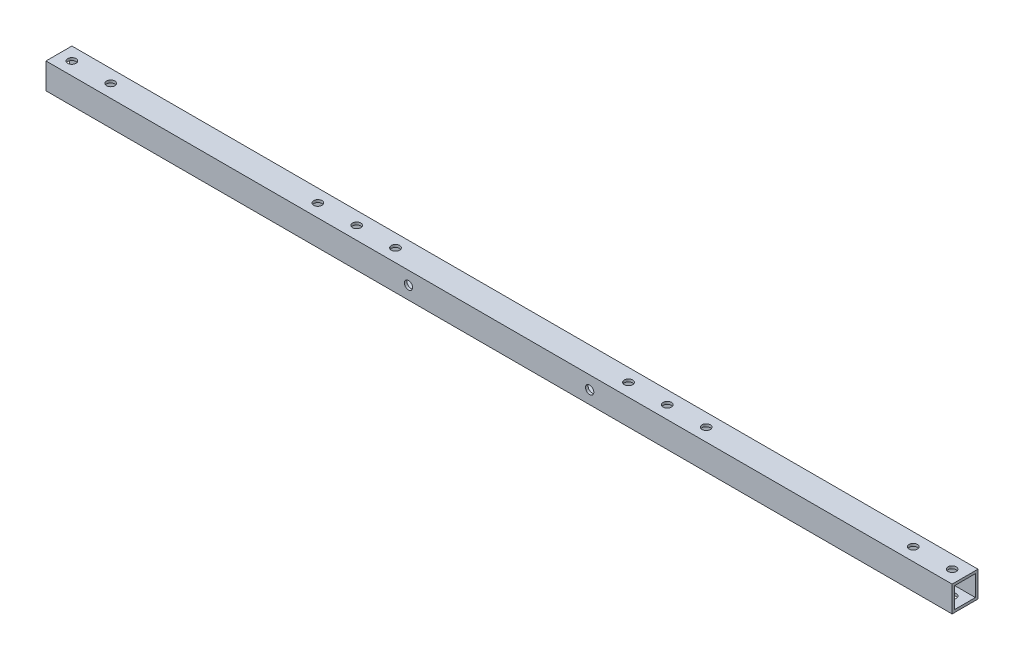
ISO-10303-21;
HEADER;
FILE_DESCRIPTION(('STEP AP214'),'2;1');
FILE_NAME('part.step','',(''),(''),'','','');
FILE_SCHEMA(('AUTOMOTIVE_DESIGN { 1 0 10303 214 1 1 1 1 }'));
ENDSEC;
DATA;
#1=APPLICATION_CONTEXT('core data for automotive mechanical design processes');
#2=APPLICATION_PROTOCOL_DEFINITION('international standard','automotive_design',2000,#1);
#3=PRODUCT_CONTEXT('',#1,'mechanical');
#4=PRODUCT('Part','Part','',(#3));
#5=PRODUCT_RELATED_PRODUCT_CATEGORY('part','',(#4));
#6=PRODUCT_DEFINITION_FORMATION('','',#4);
#7=PRODUCT_DEFINITION_CONTEXT('part definition',#1,'design');
#8=PRODUCT_DEFINITION('design','',#6,#7);
#9=PRODUCT_DEFINITION_SHAPE('','',#8);
#10=(LENGTH_UNIT() NAMED_UNIT(*) SI_UNIT(.MILLI.,.METRE.));
#11=(NAMED_UNIT(*) PLANE_ANGLE_UNIT() SI_UNIT($,.RADIAN.));
#12=(NAMED_UNIT(*) SI_UNIT($,.STERADIAN.) SOLID_ANGLE_UNIT());
#13=UNCERTAINTY_MEASURE_WITH_UNIT(LENGTH_MEASURE(1.E-05),#10,'distance_accuracy_value','');
#14=(GEOMETRIC_REPRESENTATION_CONTEXT(3) GLOBAL_UNCERTAINTY_ASSIGNED_CONTEXT((#13)) GLOBAL_UNIT_ASSIGNED_CONTEXT((#10,
#11,#12)) REPRESENTATION_CONTEXT('',''));
#15=CARTESIAN_POINT('',(0.,0.,0.));
#16=DIRECTION('',(0.,0.,1.));
#17=DIRECTION('',(1.,0.,0.));
#18=AXIS2_PLACEMENT_3D('',#15,#16,#17);
#19=CARTESIAN_POINT('',(175.,5.,5.));
#20=DIRECTION('',(0.,-1.,0.));
#21=DIRECTION('',(0.,0.,-1.));
#22=AXIS2_PLACEMENT_3D('',#19,#20,#21);
#23=PLANE('',#22);
#24=CARTESIAN_POINT('',(-75.,5.,0.));
#25=DIRECTION('',(0.,1.,0.));
#26=DIRECTION('',(0.,0.,1.));
#27=AXIS2_PLACEMENT_3D('',#24,#25,#26);
#28=CIRCLE('',#27,1.60000000000001);
#29=CARTESIAN_POINT('',(-75.,5.,1.60000000000001));
#30=VERTEX_POINT('',#29);
#31=EDGE_CURVE('E281',#30,#30,#28,.T.);
#32=ORIENTED_EDGE('',*,*,#31,.F.);
#33=EDGE_LOOP('',(#32));
#34=FACE_BOUND('',#33,.T.);
#35=CARTESIAN_POINT('',(-45.,5.,0.));
#36=DIRECTION('',(0.,1.,0.));
#37=DIRECTION('',(0.,0.,1.));
#38=AXIS2_PLACEMENT_3D('',#35,#36,#37);
#39=CIRCLE('',#38,1.60000000000001);
#40=CARTESIAN_POINT('',(-45.,5.,1.60000000000001));
#41=VERTEX_POINT('',#40);
#42=EDGE_CURVE('E285',#41,#41,#39,.T.);
#43=ORIENTED_EDGE('',*,*,#42,.F.);
#44=EDGE_LOOP('',(#43));
#45=FACE_BOUND('',#44,.T.);
#46=CARTESIAN_POINT('',(-60.,5.,0.));
#47=DIRECTION('',(0.,1.,0.));
#48=DIRECTION('',(0.,0.,1.));
#49=AXIS2_PLACEMENT_3D('',#46,#47,#48);
#50=CIRCLE('',#49,1.60000000000001);
#51=CARTESIAN_POINT('',(-60.,5.,1.60000000000001));
#52=VERTEX_POINT('',#51);
#53=EDGE_CURVE('E303',#52,#52,#50,.T.);
#54=ORIENTED_EDGE('',*,*,#53,.F.);
#55=EDGE_LOOP('',(#54));
#56=FACE_BOUND('',#55,.T.);
#57=CARTESIAN_POINT('',(-170.,5.,0.));
#58=DIRECTION('',(0.,1.,0.));
#59=DIRECTION('',(0.,0.,1.));
#60=AXIS2_PLACEMENT_3D('',#57,#58,#59);
#61=CIRCLE('',#60,1.59999999999999);
#62=CARTESIAN_POINT('',(-170.,5.,1.59999999999999));
#63=VERTEX_POINT('',#62);
#64=EDGE_CURVE('E346',#63,#63,#61,.T.);
#65=ORIENTED_EDGE('',*,*,#64,.F.);
#66=EDGE_LOOP('',(#65));
#67=FACE_BOUND('',#66,.T.);
#68=CARTESIAN_POINT('',(155.,5.,0.));
#69=DIRECTION('',(0.,1.,0.));
#70=DIRECTION('',(0.,0.,-1.));
#71=AXIS2_PLACEMENT_3D('',#68,#69,#70);
#72=CIRCLE('',#71,1.60000000000002);
#73=CARTESIAN_POINT('',(155.,5.,-1.60000000000002));
#74=VERTEX_POINT('',#73);
#75=EDGE_CURVE('E342',#74,#74,#72,.T.);
#76=ORIENTED_EDGE('',*,*,#75,.F.);
#77=EDGE_LOOP('',(#76));
#78=FACE_BOUND('',#77,.T.);
#79=CARTESIAN_POINT('',(170.,5.,0.));
#80=DIRECTION('',(0.,1.,0.));
#81=DIRECTION('',(0.,0.,-1.));
#82=AXIS2_PLACEMENT_3D('',#79,#80,#81);
#83=CIRCLE('',#82,1.59999999999999);
#84=CARTESIAN_POINT('',(170.,5.,-1.59999999999999));
#85=VERTEX_POINT('',#84);
#86=EDGE_CURVE('E355',#85,#85,#83,.T.);
#87=ORIENTED_EDGE('',*,*,#86,.F.);
#88=EDGE_LOOP('',(#87));
#89=FACE_BOUND('',#88,.T.);
#90=CARTESIAN_POINT('',(-155.,5.,0.));
#91=DIRECTION('',(0.,1.,0.));
#92=DIRECTION('',(0.,0.,1.));
#93=AXIS2_PLACEMENT_3D('',#90,#91,#92);
#94=CIRCLE('',#93,1.60000000000002);
#95=CARTESIAN_POINT('',(-155.,5.,1.60000000000002));
#96=VERTEX_POINT('',#95);
#97=EDGE_CURVE('E362',#96,#96,#94,.T.);
#98=ORIENTED_EDGE('',*,*,#97,.F.);
#99=EDGE_LOOP('',(#98));
#100=FACE_BOUND('',#99,.T.);
#101=DIRECTION('',(0.,0.,1.));
#102=VECTOR('',#101,1.);
#103=CARTESIAN_POINT('',(-175.,5.,5.));
#104=LINE('',#103,#102);
#105=CARTESIAN_POINT('',(-175.,5.,-5.));
#106=VERTEX_POINT('',#105);
#107=CARTESIAN_POINT('',(-175.,5.,5.));
#108=VERTEX_POINT('',#107);
#109=EDGE_CURVE('E177',#106,#108,#104,.T.);
#110=ORIENTED_EDGE('',*,*,#109,.T.);
#111=DIRECTION('',(-1.,0.,0.));
#112=VECTOR('',#111,1.);
#113=CARTESIAN_POINT('',(175.,5.,5.));
#114=LINE('',#113,#112);
#115=CARTESIAN_POINT('',(175.,5.,5.));
#116=VERTEX_POINT('',#115);
#117=EDGE_CURVE('E48',#116,#108,#114,.T.);
#118=ORIENTED_EDGE('',*,*,#117,.F.);
#119=DIRECTION('',(0.,0.,1.));
#120=VECTOR('',#119,1.);
#121=CARTESIAN_POINT('',(175.,5.,5.));
#122=LINE('',#121,#120);
#123=CARTESIAN_POINT('',(175.,5.,-5.));
#124=VERTEX_POINT('',#123);
#125=EDGE_CURVE('E163',#124,#116,#122,.T.);
#126=ORIENTED_EDGE('',*,*,#125,.F.);
#127=DIRECTION('',(-1.,0.,0.));
#128=VECTOR('',#127,1.);
#129=CARTESIAN_POINT('',(175.,5.,-5.));
#130=LINE('',#129,#128);
#131=EDGE_CURVE('E11',#124,#106,#130,.T.);
#132=ORIENTED_EDGE('',*,*,#131,.T.);
#133=EDGE_LOOP('',(#110,#118,#126,#132));
#134=FACE_BOUND('',#133,.T.);
#135=CARTESIAN_POINT('',(75.,5.,0.));
#136=DIRECTION('',(0.,1.,0.));
#137=DIRECTION('',(0.,0.,1.));
#138=AXIS2_PLACEMENT_3D('',#135,#136,#137);
#139=CIRCLE('',#138,1.60000000000001);
#140=CARTESIAN_POINT('',(75.,5.,1.60000000000001));
#141=VERTEX_POINT('',#140);
#142=EDGE_CURVE('E311',#141,#141,#139,.F.);
#143=ORIENTED_EDGE('',*,*,#142,.T.);
#144=EDGE_LOOP('',(#143));
#145=FACE_BOUND('',#144,.T.);
#146=CARTESIAN_POINT('',(60.,5.,0.));
#147=DIRECTION('',(0.,1.,0.));
#148=DIRECTION('',(0.,0.,1.));
#149=AXIS2_PLACEMENT_3D('',#146,#147,#148);
#150=CIRCLE('',#149,1.60000000000001);
#151=CARTESIAN_POINT('',(60.,5.,1.60000000000001));
#152=VERTEX_POINT('',#151);
#153=EDGE_CURVE('E286',#152,#152,#150,.F.);
#154=ORIENTED_EDGE('',*,*,#153,.T.);
#155=EDGE_LOOP('',(#154));
#156=FACE_BOUND('',#155,.T.);
#157=CARTESIAN_POINT('',(45.,5.,0.));
#158=DIRECTION('',(0.,1.,0.));
#159=DIRECTION('',(0.,0.,1.));
#160=AXIS2_PLACEMENT_3D('',#157,#158,#159);
#161=CIRCLE('',#160,1.60000000000001);
#162=CARTESIAN_POINT('',(45.,5.,1.60000000000001));
#163=VERTEX_POINT('',#162);
#164=EDGE_CURVE('E295',#163,#163,#161,.F.);
#165=ORIENTED_EDGE('',*,*,#164,.T.);
#166=EDGE_LOOP('',(#165));
#167=FACE_BOUND('',#166,.T.);
#168=ADVANCED_FACE('F38',(#34,#45,#56,#67,#78,#89,#100,#134,#145,#156,#167),#23,.F.);
#169=CARTESIAN_POINT('',(175.,-5.,5.));
#170=DIRECTION('',(0.,1.,0.));
#171=DIRECTION('',(0.,0.,1.));
#172=AXIS2_PLACEMENT_3D('',#169,#170,#171);
#173=PLANE('',#172);
#174=CARTESIAN_POINT('',(-75.,-5.,0.));
#175=DIRECTION('',(0.,1.,0.));
#176=DIRECTION('',(0.,0.,1.));
#177=AXIS2_PLACEMENT_3D('',#174,#175,#176);
#178=CIRCLE('',#177,1.60000000000001);
#179=CARTESIAN_POINT('',(-75.,-5.,1.60000000000001));
#180=VERTEX_POINT('',#179);
#181=EDGE_CURVE('E220',#180,#180,#178,.T.);
#182=ORIENTED_EDGE('',*,*,#181,.T.);
#183=EDGE_LOOP('',(#182));
#184=FACE_BOUND('',#183,.T.);
#185=CARTESIAN_POINT('',(-45.,-5.,0.));
#186=DIRECTION('',(0.,1.,0.));
#187=DIRECTION('',(0.,0.,1.));
#188=AXIS2_PLACEMENT_3D('',#185,#186,#187);
#189=CIRCLE('',#188,1.60000000000001);
#190=CARTESIAN_POINT('',(-45.,-5.,1.60000000000001));
#191=VERTEX_POINT('',#190);
#192=EDGE_CURVE('E307',#191,#191,#189,.T.);
#193=ORIENTED_EDGE('',*,*,#192,.T.);
#194=EDGE_LOOP('',(#193));
#195=FACE_BOUND('',#194,.T.);
#196=CARTESIAN_POINT('',(-60.,-5.,0.));
#197=DIRECTION('',(0.,1.,0.));
#198=DIRECTION('',(0.,0.,1.));
#199=AXIS2_PLACEMENT_3D('',#196,#197,#198);
#200=CIRCLE('',#199,1.60000000000001);
#201=CARTESIAN_POINT('',(-60.,-5.,1.60000000000001));
#202=VERTEX_POINT('',#201);
#203=EDGE_CURVE('E277',#202,#202,#200,.T.);
#204=ORIENTED_EDGE('',*,*,#203,.T.);
#205=EDGE_LOOP('',(#204));
#206=FACE_BOUND('',#205,.T.);
#207=CARTESIAN_POINT('',(-170.,-5.,0.));
#208=DIRECTION('',(0.,1.,0.));
#209=DIRECTION('',(0.,0.,1.));
#210=AXIS2_PLACEMENT_3D('',#207,#208,#209);
#211=CIRCLE('',#210,1.59999999999999);
#212=CARTESIAN_POINT('',(-170.,-5.,1.59999999999999));
#213=VERTEX_POINT('',#212);
#214=EDGE_CURVE('E200',#213,#213,#211,.T.);
#215=ORIENTED_EDGE('',*,*,#214,.T.);
#216=EDGE_LOOP('',(#215));
#217=FACE_BOUND('',#216,.T.);
#218=CARTESIAN_POINT('',(155.,-5.,0.));
#219=DIRECTION('',(0.,1.,0.));
#220=DIRECTION('',(0.,0.,-1.));
#221=AXIS2_PLACEMENT_3D('',#218,#219,#220);
#222=CIRCLE('',#221,1.60000000000002);
#223=CARTESIAN_POINT('',(155.,-5.,-1.60000000000002));
#224=VERTEX_POINT('',#223);
#225=EDGE_CURVE('E351',#224,#224,#222,.T.);
#226=ORIENTED_EDGE('',*,*,#225,.T.);
#227=EDGE_LOOP('',(#226));
#228=FACE_BOUND('',#227,.T.);
#229=CARTESIAN_POINT('',(170.,-5.,0.));
#230=DIRECTION('',(0.,1.,0.));
#231=DIRECTION('',(0.,0.,-1.));
#232=AXIS2_PLACEMENT_3D('',#229,#230,#231);
#233=CIRCLE('',#232,1.59999999999999);
#234=CARTESIAN_POINT('',(170.,-5.,-1.59999999999999));
#235=VERTEX_POINT('',#234);
#236=EDGE_CURVE('E366',#235,#235,#233,.T.);
#237=ORIENTED_EDGE('',*,*,#236,.T.);
#238=EDGE_LOOP('',(#237));
#239=FACE_BOUND('',#238,.T.);
#240=CARTESIAN_POINT('',(-155.,-5.,0.));
#241=DIRECTION('',(0.,1.,0.));
#242=DIRECTION('',(0.,0.,1.));
#243=AXIS2_PLACEMENT_3D('',#240,#241,#242);
#244=CIRCLE('',#243,1.60000000000002);
#245=CARTESIAN_POINT('',(-155.,-5.,1.60000000000002));
#246=VERTEX_POINT('',#245);
#247=EDGE_CURVE('E350',#246,#246,#244,.T.);
#248=ORIENTED_EDGE('',*,*,#247,.T.);
#249=EDGE_LOOP('',(#248));
#250=FACE_BOUND('',#249,.T.);
#251=DIRECTION('',(0.,0.,-1.));
#252=VECTOR('',#251,1.);
#253=CARTESIAN_POINT('',(-175.,-5.,5.));
#254=LINE('',#253,#252);
#255=CARTESIAN_POINT('',(-175.,-5.,5.));
#256=VERTEX_POINT('',#255);
#257=CARTESIAN_POINT('',(-175.,-5.,-5.));
#258=VERTEX_POINT('',#257);
#259=EDGE_CURVE('E164',#256,#258,#254,.T.);
#260=ORIENTED_EDGE('',*,*,#259,.T.);
#261=DIRECTION('',(-1.,0.,0.));
#262=VECTOR('',#261,1.);
#263=CARTESIAN_POINT('',(175.,-5.,-5.));
#264=LINE('',#263,#262);
#265=CARTESIAN_POINT('',(175.,-5.,-5.));
#266=VERTEX_POINT('',#265);
#267=EDGE_CURVE('E173',#266,#258,#264,.T.);
#268=ORIENTED_EDGE('',*,*,#267,.F.);
#269=DIRECTION('',(0.,0.,-1.));
#270=VECTOR('',#269,1.);
#271=CARTESIAN_POINT('',(175.,-5.,5.));
#272=LINE('',#271,#270);
#273=CARTESIAN_POINT('',(175.,-5.,5.));
#274=VERTEX_POINT('',#273);
#275=EDGE_CURVE('E170',#274,#266,#272,.T.);
#276=ORIENTED_EDGE('',*,*,#275,.F.);
#277=DIRECTION('',(-1.,0.,0.));
#278=VECTOR('',#277,1.);
#279=CARTESIAN_POINT('',(175.,-5.,5.));
#280=LINE('',#279,#278);
#281=EDGE_CURVE('E188',#274,#256,#280,.T.);
#282=ORIENTED_EDGE('',*,*,#281,.T.);
#283=EDGE_LOOP('',(#260,#268,#276,#282));
#284=FACE_BOUND('',#283,.T.);
#285=CARTESIAN_POINT('',(75.,-5.,0.));
#286=DIRECTION('',(0.,1.,0.));
#287=DIRECTION('',(0.,0.,1.));
#288=AXIS2_PLACEMENT_3D('',#285,#286,#287);
#289=CIRCLE('',#288,1.60000000000001);
#290=CARTESIAN_POINT('',(75.,-5.,1.60000000000001));
#291=VERTEX_POINT('',#290);
#292=EDGE_CURVE('E290',#291,#291,#289,.F.);
#293=ORIENTED_EDGE('',*,*,#292,.F.);
#294=EDGE_LOOP('',(#293));
#295=FACE_BOUND('',#294,.T.);
#296=CARTESIAN_POINT('',(60.,-5.,0.));
#297=DIRECTION('',(0.,1.,0.));
#298=DIRECTION('',(0.,0.,1.));
#299=AXIS2_PLACEMENT_3D('',#296,#297,#298);
#300=CIRCLE('',#299,1.60000000000001);
#301=CARTESIAN_POINT('',(60.,-5.,1.60000000000001));
#302=VERTEX_POINT('',#301);
#303=EDGE_CURVE('E291',#302,#302,#300,.F.);
#304=ORIENTED_EDGE('',*,*,#303,.F.);
#305=EDGE_LOOP('',(#304));
#306=FACE_BOUND('',#305,.T.);
#307=CARTESIAN_POINT('',(45.,-5.,0.));
#308=DIRECTION('',(0.,1.,0.));
#309=DIRECTION('',(0.,0.,1.));
#310=AXIS2_PLACEMENT_3D('',#307,#308,#309);
#311=CIRCLE('',#310,1.60000000000001);
#312=CARTESIAN_POINT('',(45.,-5.,1.60000000000001));
#313=VERTEX_POINT('',#312);
#314=EDGE_CURVE('E299',#313,#313,#311,.F.);
#315=ORIENTED_EDGE('',*,*,#314,.F.);
#316=EDGE_LOOP('',(#315));
#317=FACE_BOUND('',#316,.T.);
#318=ADVANCED_FACE('F409',(#184,#195,#206,#217,#228,#239,#250,#284,#295,#306,#317),#173,.F.);
#319=CARTESIAN_POINT('',(-175.,-4.,4.));
#320=DIRECTION('',(0.,-1.,0.));
#321=DIRECTION('',(0.,0.,-1.));
#322=AXIS2_PLACEMENT_3D('',#319,#320,#321);
#323=PLANE('',#322);
#324=CARTESIAN_POINT('',(-75.,-4.,0.));
#325=DIRECTION('',(0.,-1.,0.));
#326=DIRECTION('',(0.,0.,-1.));
#327=AXIS2_PLACEMENT_3D('',#324,#325,#326);
#328=CIRCLE('',#327,1.60000000000001);
#329=CARTESIAN_POINT('',(-75.,-4.,-1.60000000000001));
#330=VERTEX_POINT('',#329);
#331=EDGE_CURVE('E244',#330,#330,#328,.T.);
#332=ORIENTED_EDGE('',*,*,#331,.T.);
#333=EDGE_LOOP('',(#332));
#334=FACE_BOUND('',#333,.T.);
#335=CARTESIAN_POINT('',(-45.,-4.,0.));
#336=DIRECTION('',(0.,-1.,0.));
#337=DIRECTION('',(0.,0.,-1.));
#338=AXIS2_PLACEMENT_3D('',#335,#336,#337);
#339=CIRCLE('',#338,1.60000000000001);
#340=CARTESIAN_POINT('',(-45.,-4.,-1.60000000000001));
#341=VERTEX_POINT('',#340);
#342=EDGE_CURVE('E225',#341,#341,#339,.T.);
#343=ORIENTED_EDGE('',*,*,#342,.T.);
#344=EDGE_LOOP('',(#343));
#345=FACE_BOUND('',#344,.T.);
#346=CARTESIAN_POINT('',(-60.,-4.,0.));
#347=DIRECTION('',(0.,-1.,0.));
#348=DIRECTION('',(0.,0.,-1.));
#349=AXIS2_PLACEMENT_3D('',#346,#347,#348);
#350=CIRCLE('',#349,1.60000000000001);
#351=CARTESIAN_POINT('',(-60.,-4.,-1.60000000000001));
#352=VERTEX_POINT('',#351);
#353=EDGE_CURVE('E219',#352,#352,#350,.T.);
#354=ORIENTED_EDGE('',*,*,#353,.T.);
#355=EDGE_LOOP('',(#354));
#356=FACE_BOUND('',#355,.T.);
#357=CARTESIAN_POINT('',(-170.,-4.,0.));
#358=DIRECTION('',(0.,-1.,0.));
#359=DIRECTION('',(0.,0.,-1.));
#360=AXIS2_PLACEMENT_3D('',#357,#358,#359);
#361=CIRCLE('',#360,1.59999999999999);
#362=CARTESIAN_POINT('',(-170.,-4.,-1.59999999999999));
#363=VERTEX_POINT('',#362);
#364=EDGE_CURVE('E135',#363,#363,#361,.T.);
#365=ORIENTED_EDGE('',*,*,#364,.T.);
#366=EDGE_LOOP('',(#365));
#367=FACE_BOUND('',#366,.T.);
#368=CARTESIAN_POINT('',(155.,-4.,0.));
#369=DIRECTION('',(0.,-1.,0.));
#370=DIRECTION('',(0.,0.,-1.));
#371=AXIS2_PLACEMENT_3D('',#368,#369,#370);
#372=CIRCLE('',#371,1.60000000000002);
#373=CARTESIAN_POINT('',(155.,-4.,-1.60000000000002));
#374=VERTEX_POINT('',#373);
#375=EDGE_CURVE('E210',#374,#374,#372,.T.);
#376=ORIENTED_EDGE('',*,*,#375,.T.);
#377=EDGE_LOOP('',(#376));
#378=FACE_BOUND('',#377,.T.);
#379=CARTESIAN_POINT('',(170.,-4.,0.));
#380=DIRECTION('',(0.,-1.,0.));
#381=DIRECTION('',(0.,0.,-1.));
#382=AXIS2_PLACEMENT_3D('',#379,#380,#381);
#383=CIRCLE('',#382,1.59999999999999);
#384=CARTESIAN_POINT('',(170.,-4.,-1.59999999999999));
#385=VERTEX_POINT('',#384);
#386=EDGE_CURVE('E205',#385,#385,#383,.T.);
#387=ORIENTED_EDGE('',*,*,#386,.T.);
#388=EDGE_LOOP('',(#387));
#389=FACE_BOUND('',#388,.T.);
#390=CARTESIAN_POINT('',(-155.,-4.,0.));
#391=DIRECTION('',(0.,-1.,0.));
#392=DIRECTION('',(0.,0.,-1.));
#393=AXIS2_PLACEMENT_3D('',#390,#391,#392);
#394=CIRCLE('',#393,1.60000000000002);
#395=CARTESIAN_POINT('',(-155.,-4.,-1.60000000000002));
#396=VERTEX_POINT('',#395);
#397=EDGE_CURVE('E199',#396,#396,#394,.T.);
#398=ORIENTED_EDGE('',*,*,#397,.T.);
#399=EDGE_LOOP('',(#398));
#400=FACE_BOUND('',#399,.T.);
#401=DIRECTION('',(0.,0.,-1.));
#402=VECTOR('',#401,1.);
#403=CARTESIAN_POINT('',(175.,-4.,4.));
#404=LINE('',#403,#402);
#405=CARTESIAN_POINT('',(175.,-4.,4.));
#406=VERTEX_POINT('',#405);
#407=CARTESIAN_POINT('',(175.,-4.,-4.));
#408=VERTEX_POINT('',#407);
#409=EDGE_CURVE('E128',#406,#408,#404,.T.);
#410=ORIENTED_EDGE('',*,*,#409,.T.);
#411=DIRECTION('',(1.,0.,0.));
#412=VECTOR('',#411,1.);
#413=CARTESIAN_POINT('',(-175.,-4.,-4.));
#414=LINE('',#413,#412);
#415=CARTESIAN_POINT('',(-175.,-4.,-4.));
#416=VERTEX_POINT('',#415);
#417=EDGE_CURVE('E150',#416,#408,#414,.T.);
#418=ORIENTED_EDGE('',*,*,#417,.F.);
#419=DIRECTION('',(0.,0.,-1.));
#420=VECTOR('',#419,1.);
#421=CARTESIAN_POINT('',(-175.,-4.,4.));
#422=LINE('',#421,#420);
#423=CARTESIAN_POINT('',(-175.,-4.,4.));
#424=VERTEX_POINT('',#423);
#425=EDGE_CURVE('E115',#424,#416,#422,.T.);
#426=ORIENTED_EDGE('',*,*,#425,.F.);
#427=DIRECTION('',(1.,0.,0.));
#428=VECTOR('',#427,1.);
#429=CARTESIAN_POINT('',(-175.,-4.,4.));
#430=LINE('',#429,#428);
#431=EDGE_CURVE('E154',#424,#406,#430,.T.);
#432=ORIENTED_EDGE('',*,*,#431,.T.);
#433=EDGE_LOOP('',(#410,#418,#426,#432));
#434=FACE_BOUND('',#433,.T.);
#435=CARTESIAN_POINT('',(75.,-4.,0.));
#436=DIRECTION('',(0.,-1.,0.));
#437=DIRECTION('',(0.,0.,-1.));
#438=AXIS2_PLACEMENT_3D('',#435,#436,#437);
#439=CIRCLE('',#438,1.60000000000001);
#440=CARTESIAN_POINT('',(75.,-4.,-1.60000000000001));
#441=VERTEX_POINT('',#440);
#442=EDGE_CURVE('E230',#441,#441,#439,.F.);
#443=ORIENTED_EDGE('',*,*,#442,.F.);
#444=EDGE_LOOP('',(#443));
#445=FACE_BOUND('',#444,.T.);
#446=CARTESIAN_POINT('',(60.,-4.,0.));
#447=DIRECTION('',(0.,-1.,0.));
#448=DIRECTION('',(0.,0.,-1.));
#449=AXIS2_PLACEMENT_3D('',#446,#447,#448);
#450=CIRCLE('',#449,1.60000000000001);
#451=CARTESIAN_POINT('',(60.,-4.,-1.60000000000001));
#452=VERTEX_POINT('',#451);
#453=EDGE_CURVE('E235',#452,#452,#450,.F.);
#454=ORIENTED_EDGE('',*,*,#453,.F.);
#455=EDGE_LOOP('',(#454));
#456=FACE_BOUND('',#455,.T.);
#457=CARTESIAN_POINT('',(45.,-4.,0.));
#458=DIRECTION('',(0.,-1.,0.));
#459=DIRECTION('',(0.,0.,-1.));
#460=AXIS2_PLACEMENT_3D('',#457,#458,#459);
#461=CIRCLE('',#460,1.60000000000001);
#462=CARTESIAN_POINT('',(45.,-4.,-1.60000000000001));
#463=VERTEX_POINT('',#462);
#464=EDGE_CURVE('E240',#463,#463,#461,.F.);
#465=ORIENTED_EDGE('',*,*,#464,.F.);
#466=EDGE_LOOP('',(#465));
#467=FACE_BOUND('',#466,.T.);
#468=ADVANCED_FACE('F382',(#334,#345,#356,#367,#378,#389,#400,#434,#445,#456,#467),#323,.F.);
#469=CARTESIAN_POINT('',(-175.,4.,4.));
#470=DIRECTION('',(0.,1.,0.));
#471=DIRECTION('',(0.,0.,1.));
#472=AXIS2_PLACEMENT_3D('',#469,#470,#471);
#473=PLANE('',#472);
#474=CARTESIAN_POINT('',(-75.,4.,0.));
#475=DIRECTION('',(0.,1.,0.));
#476=DIRECTION('',(0.,0.,1.));
#477=AXIS2_PLACEMENT_3D('',#474,#475,#476);
#478=CIRCLE('',#477,1.60000000000001);
#479=CARTESIAN_POINT('',(-75.,4.,1.60000000000001));
#480=VERTEX_POINT('',#479);
#481=EDGE_CURVE('E241',#480,#480,#478,.T.);
#482=ORIENTED_EDGE('',*,*,#481,.T.);
#483=EDGE_LOOP('',(#482));
#484=FACE_BOUND('',#483,.T.);
#485=CARTESIAN_POINT('',(-45.,4.,0.));
#486=DIRECTION('',(0.,1.,0.));
#487=DIRECTION('',(0.,0.,1.));
#488=AXIS2_PLACEMENT_3D('',#485,#486,#487);
#489=CIRCLE('',#488,1.60000000000001);
#490=CARTESIAN_POINT('',(-45.,4.,1.60000000000001));
#491=VERTEX_POINT('',#490);
#492=EDGE_CURVE('E221',#491,#491,#489,.T.);
#493=ORIENTED_EDGE('',*,*,#492,.T.);
#494=EDGE_LOOP('',(#493));
#495=FACE_BOUND('',#494,.T.);
#496=CARTESIAN_POINT('',(-60.,4.,0.));
#497=DIRECTION('',(0.,1.,0.));
#498=DIRECTION('',(0.,0.,1.));
#499=AXIS2_PLACEMENT_3D('',#496,#497,#498);
#500=CIRCLE('',#499,1.60000000000001);
#501=CARTESIAN_POINT('',(-60.,4.,1.60000000000001));
#502=VERTEX_POINT('',#501);
#503=EDGE_CURVE('E215',#502,#502,#500,.T.);
#504=ORIENTED_EDGE('',*,*,#503,.T.);
#505=EDGE_LOOP('',(#504));
#506=FACE_BOUND('',#505,.T.);
#507=CARTESIAN_POINT('',(-170.,4.,0.));
#508=DIRECTION('',(0.,1.,0.));
#509=DIRECTION('',(0.,0.,1.));
#510=AXIS2_PLACEMENT_3D('',#507,#508,#509);
#511=CIRCLE('',#510,1.59999999999999);
#512=CARTESIAN_POINT('',(-170.,4.,1.59999999999999));
#513=VERTEX_POINT('',#512);
#514=EDGE_CURVE('E211',#513,#513,#511,.T.);
#515=ORIENTED_EDGE('',*,*,#514,.T.);
#516=EDGE_LOOP('',(#515));
#517=FACE_BOUND('',#516,.T.);
#518=CARTESIAN_POINT('',(155.,4.,0.));
#519=DIRECTION('',(0.,1.,0.));
#520=DIRECTION('',(0.,0.,1.));
#521=AXIS2_PLACEMENT_3D('',#518,#519,#520);
#522=CIRCLE('',#521,1.60000000000002);
#523=CARTESIAN_POINT('',(155.,4.,1.60000000000002));
#524=VERTEX_POINT('',#523);
#525=EDGE_CURVE('E206',#524,#524,#522,.T.);
#526=ORIENTED_EDGE('',*,*,#525,.T.);
#527=EDGE_LOOP('',(#526));
#528=FACE_BOUND('',#527,.T.);
#529=CARTESIAN_POINT('',(170.,4.,0.));
#530=DIRECTION('',(0.,1.,0.));
#531=DIRECTION('',(0.,0.,1.));
#532=AXIS2_PLACEMENT_3D('',#529,#530,#531);
#533=CIRCLE('',#532,1.59999999999999);
#534=CARTESIAN_POINT('',(170.,4.,1.59999999999999));
#535=VERTEX_POINT('',#534);
#536=EDGE_CURVE('E201',#535,#535,#533,.T.);
#537=ORIENTED_EDGE('',*,*,#536,.T.);
#538=EDGE_LOOP('',(#537));
#539=FACE_BOUND('',#538,.T.);
#540=CARTESIAN_POINT('',(-155.,4.,0.));
#541=DIRECTION('',(0.,1.,0.));
#542=DIRECTION('',(0.,0.,1.));
#543=AXIS2_PLACEMENT_3D('',#540,#541,#542);
#544=CIRCLE('',#543,1.60000000000002);
#545=CARTESIAN_POINT('',(-155.,4.,1.60000000000002));
#546=VERTEX_POINT('',#545);
#547=EDGE_CURVE('E195',#546,#546,#544,.T.);
#548=ORIENTED_EDGE('',*,*,#547,.T.);
#549=EDGE_LOOP('',(#548));
#550=FACE_BOUND('',#549,.T.);
#551=DIRECTION('',(0.,0.,1.));
#552=VECTOR('',#551,1.);
#553=CARTESIAN_POINT('',(175.,4.,4.));
#554=LINE('',#553,#552);
#555=CARTESIAN_POINT('',(175.,4.,-4.));
#556=VERTEX_POINT('',#555);
#557=CARTESIAN_POINT('',(175.,4.,4.));
#558=VERTEX_POINT('',#557);
#559=EDGE_CURVE('E144',#556,#558,#554,.T.);
#560=ORIENTED_EDGE('',*,*,#559,.T.);
#561=DIRECTION('',(1.,0.,0.));
#562=VECTOR('',#561,1.);
#563=CARTESIAN_POINT('',(-175.,4.,4.));
#564=LINE('',#563,#562);
#565=CARTESIAN_POINT('',(-175.,4.,4.));
#566=VERTEX_POINT('',#565);
#567=EDGE_CURVE('E114',#566,#558,#564,.T.);
#568=ORIENTED_EDGE('',*,*,#567,.F.);
#569=DIRECTION('',(0.,0.,1.));
#570=VECTOR('',#569,1.);
#571=CARTESIAN_POINT('',(-175.,4.,4.));
#572=LINE('',#571,#570);
#573=CARTESIAN_POINT('',(-175.,4.,-4.));
#574=VERTEX_POINT('',#573);
#575=EDGE_CURVE('E118',#574,#566,#572,.T.);
#576=ORIENTED_EDGE('',*,*,#575,.F.);
#577=DIRECTION('',(1.,0.,0.));
#578=VECTOR('',#577,1.);
#579=CARTESIAN_POINT('',(-175.,4.,-4.));
#580=LINE('',#579,#578);
#581=EDGE_CURVE('E104',#574,#556,#580,.T.);
#582=ORIENTED_EDGE('',*,*,#581,.T.);
#583=EDGE_LOOP('',(#560,#568,#576,#582));
#584=FACE_BOUND('',#583,.T.);
#585=CARTESIAN_POINT('',(75.,4.,0.));
#586=DIRECTION('',(0.,1.,0.));
#587=DIRECTION('',(0.,0.,1.));
#588=AXIS2_PLACEMENT_3D('',#585,#586,#587);
#589=CIRCLE('',#588,1.60000000000001);
#590=CARTESIAN_POINT('',(75.,4.,1.60000000000001));
#591=VERTEX_POINT('',#590);
#592=EDGE_CURVE('E226',#591,#591,#589,.F.);
#593=ORIENTED_EDGE('',*,*,#592,.F.);
#594=EDGE_LOOP('',(#593));
#595=FACE_BOUND('',#594,.T.);
#596=CARTESIAN_POINT('',(60.,4.,0.));
#597=DIRECTION('',(0.,1.,0.));
#598=DIRECTION('',(0.,0.,1.));
#599=AXIS2_PLACEMENT_3D('',#596,#597,#598);
#600=CIRCLE('',#599,1.60000000000001);
#601=CARTESIAN_POINT('',(60.,4.,1.60000000000001));
#602=VERTEX_POINT('',#601);
#603=EDGE_CURVE('E231',#602,#602,#600,.F.);
#604=ORIENTED_EDGE('',*,*,#603,.F.);
#605=EDGE_LOOP('',(#604));
#606=FACE_BOUND('',#605,.T.);
#607=CARTESIAN_POINT('',(45.,4.,0.));
#608=DIRECTION('',(0.,1.,0.));
#609=DIRECTION('',(0.,0.,1.));
#610=AXIS2_PLACEMENT_3D('',#607,#608,#609);
#611=CIRCLE('',#610,1.60000000000001);
#612=CARTESIAN_POINT('',(45.,4.,1.60000000000001));
#613=VERTEX_POINT('',#612);
#614=EDGE_CURVE('E236',#613,#613,#611,.F.);
#615=ORIENTED_EDGE('',*,*,#614,.F.);
#616=EDGE_LOOP('',(#615));
#617=FACE_BOUND('',#616,.T.);
#618=ADVANCED_FACE('F119',(#484,#495,#506,#517,#528,#539,#550,#584,#595,#606,#617),#473,.F.);
#619=CARTESIAN_POINT('',(175.,5.,-5.));
#620=DIRECTION('',(0.,0.,1.));
#621=DIRECTION('',(1.,0.,0.));
#622=AXIS2_PLACEMENT_3D('',#619,#620,#621);
#623=PLANE('',#622);
#624=CARTESIAN_POINT('',(-35.,0.,-5.));
#625=DIRECTION('',(0.,0.,1.));
#626=DIRECTION('',(1.,0.,0.));
#627=AXIS2_PLACEMENT_3D('',#624,#625,#626);
#628=CIRCLE('',#627,1.60000000000001);
#629=CARTESIAN_POINT('',(-33.4,0.,-5.));
#630=VERTEX_POINT('',#629);
#631=EDGE_CURVE('E249',#630,#630,#628,.T.);
#632=ORIENTED_EDGE('',*,*,#631,.T.);
#633=EDGE_LOOP('',(#632));
#634=FACE_BOUND('',#633,.T.);
#635=CARTESIAN_POINT('',(35.,0.,-5.));
#636=DIRECTION('',(0.,0.,1.));
#637=DIRECTION('',(-1.,0.,0.));
#638=AXIS2_PLACEMENT_3D('',#635,#636,#637);
#639=CIRCLE('',#638,1.60000000000001);
#640=CARTESIAN_POINT('',(33.4,0.,-5.));
#641=VERTEX_POINT('',#640);
#642=EDGE_CURVE('E263',#641,#641,#639,.T.);
#643=ORIENTED_EDGE('',*,*,#642,.T.);
#644=EDGE_LOOP('',(#643));
#645=FACE_BOUND('',#644,.T.);
#646=DIRECTION('',(0.,1.,0.));
#647=VECTOR('',#646,1.);
#648=CARTESIAN_POINT('',(-175.,5.,-5.));
#649=LINE('',#648,#647);
#650=EDGE_CURVE('E153',#258,#106,#649,.T.);
#651=ORIENTED_EDGE('',*,*,#650,.T.);
#652=ORIENTED_EDGE('',*,*,#131,.F.);
#653=DIRECTION('',(0.,1.,0.));
#654=VECTOR('',#653,1.);
#655=CARTESIAN_POINT('',(175.,5.,-5.));
#656=LINE('',#655,#654);
#657=EDGE_CURVE('E159',#266,#124,#656,.T.);
#658=ORIENTED_EDGE('',*,*,#657,.F.);
#659=ORIENTED_EDGE('',*,*,#267,.T.);
#660=EDGE_LOOP('',(#651,#652,#658,#659));
#661=FACE_BOUND('',#660,.T.);
#662=ADVANCED_FACE('F40',(#634,#645,#661),#623,.F.);
#663=CARTESIAN_POINT('',(175.,5.,5.));
#664=DIRECTION('',(0.,0.,-1.));
#665=DIRECTION('',(0.,1.,0.));
#666=AXIS2_PLACEMENT_3D('',#663,#664,#665);
#667=PLANE('',#666);
#668=CARTESIAN_POINT('',(-35.,0.,5.));
#669=DIRECTION('',(0.,0.,1.));
#670=DIRECTION('',(1.,0.,0.));
#671=AXIS2_PLACEMENT_3D('',#668,#669,#670);
#672=CIRCLE('',#671,1.60000000000001);
#673=CARTESIAN_POINT('',(-33.4,0.,5.));
#674=VERTEX_POINT('',#673);
#675=EDGE_CURVE('E257',#674,#674,#672,.T.);
#676=ORIENTED_EDGE('',*,*,#675,.F.);
#677=EDGE_LOOP('',(#676));
#678=FACE_BOUND('',#677,.T.);
#679=CARTESIAN_POINT('',(35.,0.,5.));
#680=DIRECTION('',(0.,0.,1.));
#681=DIRECTION('',(-1.,0.,0.));
#682=AXIS2_PLACEMENT_3D('',#679,#680,#681);
#683=CIRCLE('',#682,1.60000000000001);
#684=CARTESIAN_POINT('',(33.4,0.,5.));
#685=VERTEX_POINT('',#684);
#686=EDGE_CURVE('E269',#685,#685,#683,.T.);
#687=ORIENTED_EDGE('',*,*,#686,.F.);
#688=EDGE_LOOP('',(#687));
#689=FACE_BOUND('',#688,.T.);
#690=DIRECTION('',(0.,-1.,0.));
#691=VECTOR('',#690,1.);
#692=CARTESIAN_POINT('',(-175.,5.,5.));
#693=LINE('',#692,#691);
#694=EDGE_CURVE('E180',#108,#256,#693,.T.);
#695=ORIENTED_EDGE('',*,*,#694,.T.);
#696=ORIENTED_EDGE('',*,*,#281,.F.);
#697=DIRECTION('',(0.,-1.,0.));
#698=VECTOR('',#697,1.);
#699=CARTESIAN_POINT('',(175.,5.,5.));
#700=LINE('',#699,#698);
#701=EDGE_CURVE('E167',#116,#274,#700,.T.);
#702=ORIENTED_EDGE('',*,*,#701,.F.);
#703=ORIENTED_EDGE('',*,*,#117,.T.);
#704=EDGE_LOOP('',(#695,#696,#702,#703));
#705=FACE_BOUND('',#704,.T.);
#706=ADVANCED_FACE('F419',(#678,#689,#705),#667,.F.);
#707=CARTESIAN_POINT('',(175.,0.,0.));
#708=DIRECTION('',(1.,0.,0.));
#709=DIRECTION('',(0.,0.,-1.));
#710=AXIS2_PLACEMENT_3D('',#707,#708,#709);
#711=PLANE('',#710);
#712=DIRECTION('',(0.,1.,0.));
#713=VECTOR('',#712,1.);
#714=CARTESIAN_POINT('',(175.,4.,-4.));
#715=LINE('',#714,#713);
#716=EDGE_CURVE('E56',#408,#556,#715,.T.);
#717=ORIENTED_EDGE('',*,*,#716,.F.);
#718=ORIENTED_EDGE('',*,*,#409,.F.);
#719=DIRECTION('',(0.,-1.,0.));
#720=VECTOR('',#719,1.);
#721=CARTESIAN_POINT('',(175.,4.,4.));
#722=LINE('',#721,#720);
#723=EDGE_CURVE('E132',#558,#406,#722,.T.);
#724=ORIENTED_EDGE('',*,*,#723,.F.);
#725=ORIENTED_EDGE('',*,*,#559,.F.);
#726=EDGE_LOOP('',(#717,#718,#724,#725));
#727=FACE_BOUND('',#726,.T.);
#728=ORIENTED_EDGE('',*,*,#657,.T.);
#729=ORIENTED_EDGE('',*,*,#125,.T.);
#730=ORIENTED_EDGE('',*,*,#701,.T.);
#731=ORIENTED_EDGE('',*,*,#275,.T.);
#732=EDGE_LOOP('',(#728,#729,#730,#731));
#733=FACE_BOUND('',#732,.T.);
#734=ADVANCED_FACE('F421',(#727,#733),#711,.T.);
#735=CARTESIAN_POINT('',(-175.,0.,0.));
#736=DIRECTION('',(1.,0.,0.));
#737=DIRECTION('',(0.,0.,-1.));
#738=AXIS2_PLACEMENT_3D('',#735,#736,#737);
#739=PLANE('',#738);
#740=ORIENTED_EDGE('',*,*,#425,.T.);
#741=DIRECTION('',(0.,1.,0.));
#742=VECTOR('',#741,1.);
#743=CARTESIAN_POINT('',(-175.,4.,-4.));
#744=LINE('',#743,#742);
#745=EDGE_CURVE('E108',#416,#574,#744,.T.);
#746=ORIENTED_EDGE('',*,*,#745,.T.);
#747=ORIENTED_EDGE('',*,*,#575,.T.);
#748=DIRECTION('',(0.,-1.,0.));
#749=VECTOR('',#748,1.);
#750=CARTESIAN_POINT('',(-175.,4.,4.));
#751=LINE('',#750,#749);
#752=EDGE_CURVE('E64',#566,#424,#751,.T.);
#753=ORIENTED_EDGE('',*,*,#752,.T.);
#754=EDGE_LOOP('',(#740,#746,#747,#753));
#755=FACE_BOUND('',#754,.T.);
#756=ORIENTED_EDGE('',*,*,#650,.F.);
#757=ORIENTED_EDGE('',*,*,#259,.F.);
#758=ORIENTED_EDGE('',*,*,#694,.F.);
#759=ORIENTED_EDGE('',*,*,#109,.F.);
#760=EDGE_LOOP('',(#756,#757,#758,#759));
#761=FACE_BOUND('',#760,.T.);
#762=ADVANCED_FACE('F124',(#755,#761),#739,.F.);
#763=CARTESIAN_POINT('',(-175.,4.,-4.));
#764=DIRECTION('',(0.,0.,-1.));
#765=DIRECTION('',(-1.,0.,0.));
#766=AXIS2_PLACEMENT_3D('',#763,#764,#765);
#767=PLANE('',#766);
#768=CARTESIAN_POINT('',(-35.,0.,-4.));
#769=DIRECTION('',(0.,0.,-1.));
#770=DIRECTION('',(-1.,0.,0.));
#771=AXIS2_PLACEMENT_3D('',#768,#769,#770);
#772=CIRCLE('',#771,1.60000000000001);
#773=CARTESIAN_POINT('',(-36.6,0.,-4.));
#774=VERTEX_POINT('',#773);
#775=EDGE_CURVE('E273',#774,#774,#772,.T.);
#776=ORIENTED_EDGE('',*,*,#775,.T.);
#777=EDGE_LOOP('',(#776));
#778=FACE_BOUND('',#777,.T.);
#779=CARTESIAN_POINT('',(35.,0.,-4.));
#780=DIRECTION('',(0.,0.,-1.));
#781=DIRECTION('',(-1.,0.,0.));
#782=AXIS2_PLACEMENT_3D('',#779,#780,#781);
#783=CIRCLE('',#782,1.60000000000001);
#784=CARTESIAN_POINT('',(33.4,0.,-4.));
#785=VERTEX_POINT('',#784);
#786=EDGE_CURVE('E248',#785,#785,#783,.T.);
#787=ORIENTED_EDGE('',*,*,#786,.T.);
#788=EDGE_LOOP('',(#787));
#789=FACE_BOUND('',#788,.T.);
#790=ORIENTED_EDGE('',*,*,#716,.T.);
#791=ORIENTED_EDGE('',*,*,#581,.F.);
#792=ORIENTED_EDGE('',*,*,#745,.F.);
#793=ORIENTED_EDGE('',*,*,#417,.T.);
#794=EDGE_LOOP('',(#790,#791,#792,#793));
#795=FACE_BOUND('',#794,.T.);
#796=ADVANCED_FACE('F106',(#778,#789,#795),#767,.F.);
#797=CARTESIAN_POINT('',(-175.,4.,4.));
#798=DIRECTION('',(0.,0.,1.));
#799=DIRECTION('',(1.,0.,0.));
#800=AXIS2_PLACEMENT_3D('',#797,#798,#799);
#801=PLANE('',#800);
#802=CARTESIAN_POINT('',(-35.,0.,4.));
#803=DIRECTION('',(0.,0.,1.));
#804=DIRECTION('',(1.,0.,0.));
#805=AXIS2_PLACEMENT_3D('',#802,#803,#804);
#806=CIRCLE('',#805,1.60000000000001);
#807=CARTESIAN_POINT('',(-33.4,0.,4.));
#808=VERTEX_POINT('',#807);
#809=EDGE_CURVE('E42',#808,#808,#806,.T.);
#810=ORIENTED_EDGE('',*,*,#809,.T.);
#811=EDGE_LOOP('',(#810));
#812=FACE_BOUND('',#811,.T.);
#813=CARTESIAN_POINT('',(35.,0.,4.));
#814=DIRECTION('',(0.,0.,1.));
#815=DIRECTION('',(1.,0.,0.));
#816=AXIS2_PLACEMENT_3D('',#813,#814,#815);
#817=CIRCLE('',#816,1.60000000000001);
#818=CARTESIAN_POINT('',(36.6,0.,4.));
#819=VERTEX_POINT('',#818);
#820=EDGE_CURVE('E245',#819,#819,#817,.T.);
#821=ORIENTED_EDGE('',*,*,#820,.T.);
#822=EDGE_LOOP('',(#821));
#823=FACE_BOUND('',#822,.T.);
#824=ORIENTED_EDGE('',*,*,#723,.T.);
#825=ORIENTED_EDGE('',*,*,#431,.F.);
#826=ORIENTED_EDGE('',*,*,#752,.F.);
#827=ORIENTED_EDGE('',*,*,#567,.T.);
#828=EDGE_LOOP('',(#824,#825,#826,#827));
#829=FACE_BOUND('',#828,.T.);
#830=ADVANCED_FACE('F431',(#812,#823,#829),#801,.F.);
#831=CARTESIAN_POINT('',(-155.,-5.,0.));
#832=DIRECTION('',(0.,1.,0.));
#833=DIRECTION('',(0.,0.,1.));
#834=AXIS2_PLACEMENT_3D('',#831,#832,#833);
#835=CYLINDRICAL_SURFACE('',#834,1.60000000000002);
#836=ORIENTED_EDGE('',*,*,#97,.T.);
#837=EDGE_LOOP('',(#836));
#838=FACE_BOUND('',#837,.T.);
#839=ORIENTED_EDGE('',*,*,#547,.F.);
#840=EDGE_LOOP('',(#839));
#841=FACE_BOUND('',#840,.T.);
#842=ADVANCED_FACE('F438',(#838,#841),#835,.F.);
#843=CARTESIAN_POINT('',(170.,-5.,0.));
#844=DIRECTION('',(0.,1.,0.));
#845=DIRECTION('',(0.,0.,1.));
#846=AXIS2_PLACEMENT_3D('',#843,#844,#845);
#847=CYLINDRICAL_SURFACE('',#846,1.59999999999999);
#848=ORIENTED_EDGE('',*,*,#86,.T.);
#849=EDGE_LOOP('',(#848));
#850=FACE_BOUND('',#849,.T.);
#851=ORIENTED_EDGE('',*,*,#536,.F.);
#852=EDGE_LOOP('',(#851));
#853=FACE_BOUND('',#852,.T.);
#854=ADVANCED_FACE('F403',(#850,#853),#847,.F.);
#855=CARTESIAN_POINT('',(155.,-5.,0.));
#856=DIRECTION('',(0.,1.,0.));
#857=DIRECTION('',(0.,0.,1.));
#858=AXIS2_PLACEMENT_3D('',#855,#856,#857);
#859=CYLINDRICAL_SURFACE('',#858,1.60000000000002);
#860=ORIENTED_EDGE('',*,*,#75,.T.);
#861=EDGE_LOOP('',(#860));
#862=FACE_BOUND('',#861,.T.);
#863=ORIENTED_EDGE('',*,*,#525,.F.);
#864=EDGE_LOOP('',(#863));
#865=FACE_BOUND('',#864,.T.);
#866=ADVANCED_FACE('F391',(#862,#865),#859,.F.);
#867=CARTESIAN_POINT('',(-170.,-5.,0.));
#868=DIRECTION('',(0.,1.,0.));
#869=DIRECTION('',(0.,0.,1.));
#870=AXIS2_PLACEMENT_3D('',#867,#868,#869);
#871=CYLINDRICAL_SURFACE('',#870,1.59999999999999);
#872=ORIENTED_EDGE('',*,*,#64,.T.);
#873=EDGE_LOOP('',(#872));
#874=FACE_BOUND('',#873,.T.);
#875=ORIENTED_EDGE('',*,*,#514,.F.);
#876=EDGE_LOOP('',(#875));
#877=FACE_BOUND('',#876,.T.);
#878=ADVANCED_FACE('F399',(#874,#877),#871,.F.);
#879=ORIENTED_EDGE('',*,*,#247,.F.);
#880=EDGE_LOOP('',(#879));
#881=FACE_BOUND('',#880,.T.);
#882=ORIENTED_EDGE('',*,*,#397,.F.);
#883=EDGE_LOOP('',(#882));
#884=FACE_BOUND('',#883,.T.);
#885=ADVANCED_FACE('F400',(#881,#884),#835,.F.);
#886=ORIENTED_EDGE('',*,*,#236,.F.);
#887=EDGE_LOOP('',(#886));
#888=FACE_BOUND('',#887,.T.);
#889=ORIENTED_EDGE('',*,*,#386,.F.);
#890=EDGE_LOOP('',(#889));
#891=FACE_BOUND('',#890,.T.);
#892=ADVANCED_FACE('F388',(#888,#891),#847,.F.);
#893=ORIENTED_EDGE('',*,*,#225,.F.);
#894=EDGE_LOOP('',(#893));
#895=FACE_BOUND('',#894,.T.);
#896=ORIENTED_EDGE('',*,*,#375,.F.);
#897=EDGE_LOOP('',(#896));
#898=FACE_BOUND('',#897,.T.);
#899=ADVANCED_FACE('F385',(#895,#898),#859,.F.);
#900=ORIENTED_EDGE('',*,*,#214,.F.);
#901=EDGE_LOOP('',(#900));
#902=FACE_BOUND('',#901,.T.);
#903=ORIENTED_EDGE('',*,*,#364,.F.);
#904=EDGE_LOOP('',(#903));
#905=FACE_BOUND('',#904,.T.);
#906=ADVANCED_FACE('F387',(#902,#905),#871,.F.);
#907=CARTESIAN_POINT('',(-60.,-5.,0.));
#908=DIRECTION('',(0.,1.,0.));
#909=DIRECTION('',(0.,0.,1.));
#910=AXIS2_PLACEMENT_3D('',#907,#908,#909);
#911=CYLINDRICAL_SURFACE('',#910,1.60000000000001);
#912=ORIENTED_EDGE('',*,*,#53,.T.);
#913=EDGE_LOOP('',(#912));
#914=FACE_BOUND('',#913,.T.);
#915=ORIENTED_EDGE('',*,*,#503,.F.);
#916=EDGE_LOOP('',(#915));
#917=FACE_BOUND('',#916,.T.);
#918=ADVANCED_FACE('F396',(#914,#917),#911,.F.);
#919=CARTESIAN_POINT('',(-45.,-5.,0.));
#920=DIRECTION('',(0.,1.,0.));
#921=DIRECTION('',(0.,0.,1.));
#922=AXIS2_PLACEMENT_3D('',#919,#920,#921);
#923=CYLINDRICAL_SURFACE('',#922,1.60000000000001);
#924=ORIENTED_EDGE('',*,*,#42,.T.);
#925=EDGE_LOOP('',(#924));
#926=FACE_BOUND('',#925,.T.);
#927=ORIENTED_EDGE('',*,*,#492,.F.);
#928=EDGE_LOOP('',(#927));
#929=FACE_BOUND('',#928,.T.);
#930=ADVANCED_FACE('F633',(#926,#929),#923,.F.);
#931=CARTESIAN_POINT('',(75.,-5.,0.));
#932=DIRECTION('',(0.,1.,0.));
#933=DIRECTION('',(0.,0.,1.));
#934=AXIS2_PLACEMENT_3D('',#931,#932,#933);
#935=CYLINDRICAL_SURFACE('',#934,1.60000000000001);
#936=ORIENTED_EDGE('',*,*,#142,.F.);
#937=EDGE_LOOP('',(#936));
#938=FACE_BOUND('',#937,.T.);
#939=ORIENTED_EDGE('',*,*,#592,.T.);
#940=EDGE_LOOP('',(#939));
#941=FACE_BOUND('',#940,.T.);
#942=ADVANCED_FACE('F488',(#938,#941),#935,.F.);
#943=CARTESIAN_POINT('',(60.,-5.,0.));
#944=DIRECTION('',(0.,1.,0.));
#945=DIRECTION('',(0.,0.,1.));
#946=AXIS2_PLACEMENT_3D('',#943,#944,#945);
#947=CYLINDRICAL_SURFACE('',#946,1.60000000000001);
#948=ORIENTED_EDGE('',*,*,#153,.F.);
#949=EDGE_LOOP('',(#948));
#950=FACE_BOUND('',#949,.T.);
#951=ORIENTED_EDGE('',*,*,#603,.T.);
#952=EDGE_LOOP('',(#951));
#953=FACE_BOUND('',#952,.T.);
#954=ADVANCED_FACE('F475',(#950,#953),#947,.F.);
#955=CARTESIAN_POINT('',(45.,-5.,0.));
#956=DIRECTION('',(0.,1.,0.));
#957=DIRECTION('',(0.,0.,1.));
#958=AXIS2_PLACEMENT_3D('',#955,#956,#957);
#959=CYLINDRICAL_SURFACE('',#958,1.60000000000001);
#960=ORIENTED_EDGE('',*,*,#164,.F.);
#961=EDGE_LOOP('',(#960));
#962=FACE_BOUND('',#961,.T.);
#963=ORIENTED_EDGE('',*,*,#614,.T.);
#964=EDGE_LOOP('',(#963));
#965=FACE_BOUND('',#964,.T.);
#966=ADVANCED_FACE('F471',(#962,#965),#959,.F.);
#967=CARTESIAN_POINT('',(-75.,-5.,0.));
#968=DIRECTION('',(0.,1.,0.));
#969=DIRECTION('',(0.,0.,1.));
#970=AXIS2_PLACEMENT_3D('',#967,#968,#969);
#971=CYLINDRICAL_SURFACE('',#970,1.60000000000001);
#972=ORIENTED_EDGE('',*,*,#31,.T.);
#973=EDGE_LOOP('',(#972));
#974=FACE_BOUND('',#973,.T.);
#975=ORIENTED_EDGE('',*,*,#481,.F.);
#976=EDGE_LOOP('',(#975));
#977=FACE_BOUND('',#976,.T.);
#978=ADVANCED_FACE('F474',(#974,#977),#971,.F.);
#979=ORIENTED_EDGE('',*,*,#203,.F.);
#980=EDGE_LOOP('',(#979));
#981=FACE_BOUND('',#980,.T.);
#982=ORIENTED_EDGE('',*,*,#353,.F.);
#983=EDGE_LOOP('',(#982));
#984=FACE_BOUND('',#983,.T.);
#985=ADVANCED_FACE('F484',(#981,#984),#911,.F.);
#986=ORIENTED_EDGE('',*,*,#192,.F.);
#987=EDGE_LOOP('',(#986));
#988=FACE_BOUND('',#987,.T.);
#989=ORIENTED_EDGE('',*,*,#342,.F.);
#990=EDGE_LOOP('',(#989));
#991=FACE_BOUND('',#990,.T.);
#992=ADVANCED_FACE('F511',(#988,#991),#923,.F.);
#993=ORIENTED_EDGE('',*,*,#292,.T.);
#994=EDGE_LOOP('',(#993));
#995=FACE_BOUND('',#994,.T.);
#996=ORIENTED_EDGE('',*,*,#442,.T.);
#997=EDGE_LOOP('',(#996));
#998=FACE_BOUND('',#997,.T.);
#999=ADVANCED_FACE('F501',(#995,#998),#935,.F.);
#1000=ORIENTED_EDGE('',*,*,#303,.T.);
#1001=EDGE_LOOP('',(#1000));
#1002=FACE_BOUND('',#1001,.T.);
#1003=ORIENTED_EDGE('',*,*,#453,.T.);
#1004=EDGE_LOOP('',(#1003));
#1005=FACE_BOUND('',#1004,.T.);
#1006=ADVANCED_FACE('F491',(#1002,#1005),#947,.F.);
#1007=ORIENTED_EDGE('',*,*,#314,.T.);
#1008=EDGE_LOOP('',(#1007));
#1009=FACE_BOUND('',#1008,.T.);
#1010=ORIENTED_EDGE('',*,*,#464,.T.);
#1011=EDGE_LOOP('',(#1010));
#1012=FACE_BOUND('',#1011,.T.);
#1013=ADVANCED_FACE('F477',(#1009,#1012),#959,.F.);
#1014=ORIENTED_EDGE('',*,*,#181,.F.);
#1015=EDGE_LOOP('',(#1014));
#1016=FACE_BOUND('',#1015,.T.);
#1017=ORIENTED_EDGE('',*,*,#331,.F.);
#1018=EDGE_LOOP('',(#1017));
#1019=FACE_BOUND('',#1018,.T.);
#1020=ADVANCED_FACE('F487',(#1016,#1019),#971,.F.);
#1021=CARTESIAN_POINT('',(35.,0.,-5.));
#1022=DIRECTION('',(0.,0.,1.));
#1023=DIRECTION('',(1.,0.,0.));
#1024=AXIS2_PLACEMENT_3D('',#1021,#1022,#1023);
#1025=CYLINDRICAL_SURFACE('',#1024,1.60000000000001);
#1026=ORIENTED_EDGE('',*,*,#686,.T.);
#1027=EDGE_LOOP('',(#1026));
#1028=FACE_BOUND('',#1027,.T.);
#1029=ORIENTED_EDGE('',*,*,#820,.F.);
#1030=EDGE_LOOP('',(#1029));
#1031=FACE_BOUND('',#1030,.T.);
#1032=ADVANCED_FACE('F499',(#1028,#1031),#1025,.F.);
#1033=CARTESIAN_POINT('',(-35.,0.,-5.));
#1034=DIRECTION('',(0.,0.,1.));
#1035=DIRECTION('',(1.,0.,0.));
#1036=AXIS2_PLACEMENT_3D('',#1033,#1034,#1035);
#1037=CYLINDRICAL_SURFACE('',#1036,1.60000000000001);
#1038=ORIENTED_EDGE('',*,*,#675,.T.);
#1039=EDGE_LOOP('',(#1038));
#1040=FACE_BOUND('',#1039,.T.);
#1041=ORIENTED_EDGE('',*,*,#809,.F.);
#1042=EDGE_LOOP('',(#1041));
#1043=FACE_BOUND('',#1042,.T.);
#1044=ADVANCED_FACE('F520',(#1040,#1043),#1037,.F.);
#1045=ORIENTED_EDGE('',*,*,#642,.F.);
#1046=EDGE_LOOP('',(#1045));
#1047=FACE_BOUND('',#1046,.T.);
#1048=ORIENTED_EDGE('',*,*,#786,.F.);
#1049=EDGE_LOOP('',(#1048));
#1050=FACE_BOUND('',#1049,.T.);
#1051=ADVANCED_FACE('F516',(#1047,#1050),#1025,.F.);
#1052=ORIENTED_EDGE('',*,*,#631,.F.);
#1053=EDGE_LOOP('',(#1052));
#1054=FACE_BOUND('',#1053,.T.);
#1055=ORIENTED_EDGE('',*,*,#775,.F.);
#1056=EDGE_LOOP('',(#1055));
#1057=FACE_BOUND('',#1056,.T.);
#1058=ADVANCED_FACE('F519',(#1054,#1057),#1037,.F.);
#1059=CLOSED_SHELL('',(#168,#318,#468,#618,#662,#706,#734,#762,#796,#830,#842,#854,#866,#878,
#885,#892,#899,#906,#918,#930,#942,#954,#966,#978,#985,#992,#999,#1006,#1013,#1020,#1032,#1044,
#1051,#1058));
#1060=MANIFOLD_SOLID_BREP('B2',#1059);
#1061=ADVANCED_BREP_SHAPE_REPRESENTATION('',(#18,#1060),#14);
#1062=SHAPE_DEFINITION_REPRESENTATION(#9,#1061);
ENDSEC;
END-ISO-10303-21;
